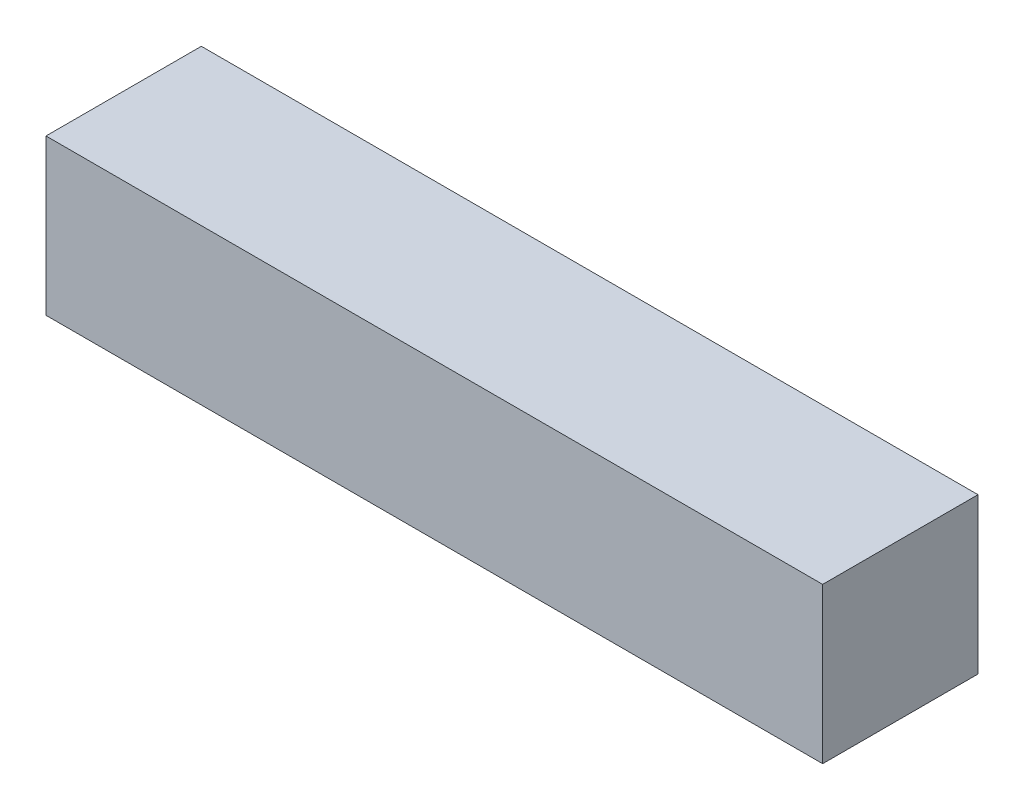
ISO-10303-21;
HEADER;
FILE_DESCRIPTION(('STEP AP214'),'2;1');
FILE_NAME('part.step','',(''),(''),'','','');
FILE_SCHEMA(('AUTOMOTIVE_DESIGN { 1 0 10303 214 1 1 1 1 }'));
ENDSEC;
DATA;
#1=APPLICATION_CONTEXT('core data for automotive mechanical design processes');
#2=APPLICATION_PROTOCOL_DEFINITION('international standard','automotive_design',2000,#1);
#3=PRODUCT_CONTEXT('',#1,'mechanical');
#4=PRODUCT('Part','Part','',(#3));
#5=PRODUCT_RELATED_PRODUCT_CATEGORY('part','',(#4));
#6=PRODUCT_DEFINITION_FORMATION('','',#4);
#7=PRODUCT_DEFINITION_CONTEXT('part definition',#1,'design');
#8=PRODUCT_DEFINITION('design','',#6,#7);
#9=PRODUCT_DEFINITION_SHAPE('','',#8);
#10=(LENGTH_UNIT() NAMED_UNIT(*) SI_UNIT(.MILLI.,.METRE.));
#11=(NAMED_UNIT(*) PLANE_ANGLE_UNIT() SI_UNIT($,.RADIAN.));
#12=(NAMED_UNIT(*) SI_UNIT($,.STERADIAN.) SOLID_ANGLE_UNIT());
#13=UNCERTAINTY_MEASURE_WITH_UNIT(LENGTH_MEASURE(1.E-05),#10,'distance_accuracy_value','');
#14=(GEOMETRIC_REPRESENTATION_CONTEXT(3) GLOBAL_UNCERTAINTY_ASSIGNED_CONTEXT((#13)) GLOBAL_UNIT_ASSIGNED_CONTEXT((#10,
#11,#12)) REPRESENTATION_CONTEXT('',''));
#15=CARTESIAN_POINT('',(0.,0.,0.));
#16=DIRECTION('',(0.,0.,1.));
#17=DIRECTION('',(1.,0.,0.));
#18=AXIS2_PLACEMENT_3D('',#15,#16,#17);
#19=CARTESIAN_POINT('',(2.71328924651546,-6.5910767944991,9.39000002386792));
#20=DIRECTION('',(0.,0.,1.));
#21=DIRECTION('',(0.,1.,0.));
#22=AXIS2_PLACEMENT_3D('',#19,#20,#21);
#23=PLANE('',#22);
#24=DIRECTION('',(0.,1.,0.));
#25=VECTOR('',#24,1.);
#26=CARTESIAN_POINT('',(5.71328924651546,-6.5910767944991,9.39000002386792));
#27=LINE('',#26,#25);
#28=CARTESIAN_POINT('',(5.71328924651546,-6.5910767944991,9.39000002386792));
#29=VERTEX_POINT('',#28);
#30=CARTESIAN_POINT('',(5.71328924651546,-5.9910767706571,9.39000002386792));
#31=VERTEX_POINT('',#30);
#32=EDGE_CURVE('E27',#29,#31,#27,.T.);
#33=ORIENTED_EDGE('',*,*,#32,.T.);
#34=DIRECTION('',(-1.,0.,0.));
#35=VECTOR('',#34,1.);
#36=CARTESIAN_POINT('',(2.71328924651546,-5.9910767706571,9.39000002386792));
#37=LINE('',#36,#35);
#38=CARTESIAN_POINT('',(2.71328924651546,-5.9910767706571,9.39000002386792));
#39=VERTEX_POINT('',#38);
#40=EDGE_CURVE('E11',#31,#39,#37,.T.);
#41=ORIENTED_EDGE('',*,*,#40,.T.);
#42=DIRECTION('',(0.,-1.,0.));
#43=VECTOR('',#42,1.);
#44=CARTESIAN_POINT('',(2.71328924651546,-6.5910767944991,9.39000002386792));
#45=LINE('',#44,#43);
#46=CARTESIAN_POINT('',(2.71328924651546,-6.5910767944991,9.39000002386792));
#47=VERTEX_POINT('',#46);
#48=EDGE_CURVE('E115',#39,#47,#45,.T.);
#49=ORIENTED_EDGE('',*,*,#48,.T.);
#50=DIRECTION('',(1.,0.,0.));
#51=VECTOR('',#50,1.);
#52=CARTESIAN_POINT('',(2.71328924651546,-6.5910767944991,9.39000002386792));
#53=LINE('',#52,#51);
#54=EDGE_CURVE('E66',#47,#29,#53,.T.);
#55=ORIENTED_EDGE('',*,*,#54,.T.);
#56=EDGE_LOOP('',(#33,#41,#49,#55));
#57=FACE_BOUND('',#56,.T.);
#58=ADVANCED_FACE('F16',(#57),#23,.T.);
#59=CARTESIAN_POINT('',(2.71328924651546,-5.9910767706571,8.79000000002592));
#60=DIRECTION('',(0.,1.,0.));
#61=DIRECTION('',(0.,0.,1.));
#62=AXIS2_PLACEMENT_3D('',#59,#60,#61);
#63=PLANE('',#62);
#64=ORIENTED_EDGE('',*,*,#40,.F.);
#65=DIRECTION('',(0.,0.,-1.));
#66=VECTOR('',#65,1.);
#67=CARTESIAN_POINT('',(5.71328924651546,-5.9910767706571,8.79000000002592));
#68=LINE('',#67,#66);
#69=CARTESIAN_POINT('',(5.71328924651546,-5.9910767706571,8.79000000002592));
#70=VERTEX_POINT('',#69);
#71=EDGE_CURVE('E84',#31,#70,#68,.T.);
#72=ORIENTED_EDGE('',*,*,#71,.T.);
#73=DIRECTION('',(-1.,0.,0.));
#74=VECTOR('',#73,1.);
#75=CARTESIAN_POINT('',(2.71328924651546,-5.9910767706571,8.79000000002592));
#76=LINE('',#75,#74);
#77=CARTESIAN_POINT('',(2.71328924651546,-5.9910767706571,8.79000000002592));
#78=VERTEX_POINT('',#77);
#79=EDGE_CURVE('E20',#70,#78,#76,.T.);
#80=ORIENTED_EDGE('',*,*,#79,.T.);
#81=DIRECTION('',(0.,0.,1.));
#82=VECTOR('',#81,1.);
#83=CARTESIAN_POINT('',(2.71328924651546,-5.9910767706571,8.79000000002592));
#84=LINE('',#83,#82);
#85=EDGE_CURVE('E78',#78,#39,#84,.T.);
#86=ORIENTED_EDGE('',*,*,#85,.T.);
#87=EDGE_LOOP('',(#64,#72,#80,#86));
#88=FACE_BOUND('',#87,.T.);
#89=ADVANCED_FACE('F86',(#88),#63,.T.);
#90=CARTESIAN_POINT('',(5.71328924651546,-6.5910767944991,8.79000000002592));
#91=DIRECTION('',(1.,0.,0.));
#92=DIRECTION('',(0.,1.,0.));
#93=AXIS2_PLACEMENT_3D('',#90,#91,#92);
#94=PLANE('',#93);
#95=ORIENTED_EDGE('',*,*,#71,.F.);
#96=ORIENTED_EDGE('',*,*,#32,.F.);
#97=DIRECTION('',(0.,0.,-1.));
#98=VECTOR('',#97,1.);
#99=CARTESIAN_POINT('',(5.71328924651546,-6.5910767944991,8.79000000002592));
#100=LINE('',#99,#98);
#101=CARTESIAN_POINT('',(5.71328924651546,-6.5910767944991,8.79000000002592));
#102=VERTEX_POINT('',#101);
#103=EDGE_CURVE('E94',#29,#102,#100,.T.);
#104=ORIENTED_EDGE('',*,*,#103,.T.);
#105=DIRECTION('',(0.,1.,0.));
#106=VECTOR('',#105,1.);
#107=CARTESIAN_POINT('',(5.71328924651546,-6.5910767944991,8.79000000002592));
#108=LINE('',#107,#106);
#109=EDGE_CURVE('E93',#102,#70,#108,.T.);
#110=ORIENTED_EDGE('',*,*,#109,.T.);
#111=EDGE_LOOP('',(#95,#96,#104,#110));
#112=FACE_BOUND('',#111,.T.);
#113=ADVANCED_FACE('F18',(#112),#94,.T.);
#114=CARTESIAN_POINT('',(2.71328924651546,-6.5910767944991,8.79000000002592));
#115=DIRECTION('',(0.,1.,0.));
#116=DIRECTION('',(0.,0.,1.));
#117=AXIS2_PLACEMENT_3D('',#114,#115,#116);
#118=PLANE('',#117);
#119=DIRECTION('',(-1.,0.,0.));
#120=VECTOR('',#119,1.);
#121=CARTESIAN_POINT('',(2.71328924651546,-6.5910767944991,8.79000000002592));
#122=LINE('',#121,#120);
#123=CARTESIAN_POINT('',(2.71328924651546,-6.5910767944991,8.79000000002592));
#124=VERTEX_POINT('',#123);
#125=EDGE_CURVE('E99',#102,#124,#122,.T.);
#126=ORIENTED_EDGE('',*,*,#125,.F.);
#127=ORIENTED_EDGE('',*,*,#103,.F.);
#128=ORIENTED_EDGE('',*,*,#54,.F.);
#129=DIRECTION('',(0.,0.,1.));
#130=VECTOR('',#129,1.);
#131=CARTESIAN_POINT('',(2.71328924651546,-6.5910767944991,8.79000000002592));
#132=LINE('',#131,#130);
#133=EDGE_CURVE('E119',#124,#47,#132,.T.);
#134=ORIENTED_EDGE('',*,*,#133,.F.);
#135=EDGE_LOOP('',(#126,#127,#128,#134));
#136=FACE_BOUND('',#135,.T.);
#137=ADVANCED_FACE('F133',(#136),#118,.F.);
#138=CARTESIAN_POINT('',(2.71328924651546,-6.5910767944991,8.79000000002592));
#139=DIRECTION('',(1.,0.,0.));
#140=DIRECTION('',(0.,1.,0.));
#141=AXIS2_PLACEMENT_3D('',#138,#139,#140);
#142=PLANE('',#141);
#143=ORIENTED_EDGE('',*,*,#133,.T.);
#144=ORIENTED_EDGE('',*,*,#48,.F.);
#145=ORIENTED_EDGE('',*,*,#85,.F.);
#146=DIRECTION('',(0.,1.,0.));
#147=VECTOR('',#146,1.);
#148=CARTESIAN_POINT('',(2.71328924651546,-6.5910767944991,8.79000000002592));
#149=LINE('',#148,#147);
#150=EDGE_CURVE('E101',#124,#78,#149,.T.);
#151=ORIENTED_EDGE('',*,*,#150,.F.);
#152=EDGE_LOOP('',(#143,#144,#145,#151));
#153=FACE_BOUND('',#152,.T.);
#154=ADVANCED_FACE('F134',(#153),#142,.F.);
#155=CARTESIAN_POINT('',(2.71328924651546,-6.5910767944991,8.79000000002592));
#156=DIRECTION('',(0.,0.,1.));
#157=DIRECTION('',(0.,1.,0.));
#158=AXIS2_PLACEMENT_3D('',#155,#156,#157);
#159=PLANE('',#158);
#160=ORIENTED_EDGE('',*,*,#150,.T.);
#161=ORIENTED_EDGE('',*,*,#79,.F.);
#162=ORIENTED_EDGE('',*,*,#109,.F.);
#163=ORIENTED_EDGE('',*,*,#125,.T.);
#164=EDGE_LOOP('',(#160,#161,#162,#163));
#165=FACE_BOUND('',#164,.T.);
#166=ADVANCED_FACE('F100',(#165),#159,.F.);
#167=CLOSED_SHELL('',(#58,#89,#113,#137,#154,#166));
#168=MANIFOLD_SOLID_BREP('B1',#167);
#169=ADVANCED_BREP_SHAPE_REPRESENTATION('',(#18,#168),#14);
#170=SHAPE_DEFINITION_REPRESENTATION(#9,#169);
ENDSEC;
END-ISO-10303-21;
